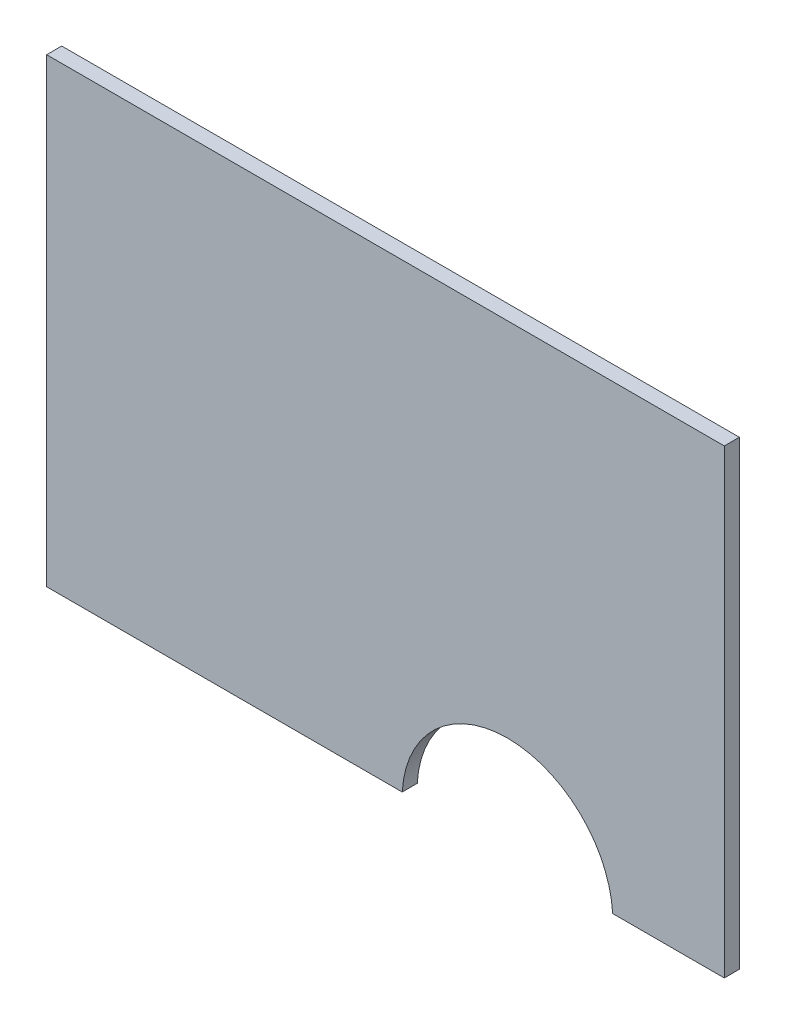
ISO-10303-21;
HEADER;
FILE_DESCRIPTION(('STEP AP214'),'2;1');
FILE_NAME('part.step','',(''),(''),'','','');
FILE_SCHEMA(('AUTOMOTIVE_DESIGN { 1 0 10303 214 1 1 1 1 }'));
ENDSEC;
DATA;
#1=APPLICATION_CONTEXT('core data for automotive mechanical design processes');
#2=APPLICATION_PROTOCOL_DEFINITION('international standard','automotive_design',2000,#1);
#3=PRODUCT_CONTEXT('',#1,'mechanical');
#4=PRODUCT('Part','Part','',(#3));
#5=PRODUCT_RELATED_PRODUCT_CATEGORY('part','',(#4));
#6=PRODUCT_DEFINITION_FORMATION('','',#4);
#7=PRODUCT_DEFINITION_CONTEXT('part definition',#1,'design');
#8=PRODUCT_DEFINITION('design','',#6,#7);
#9=PRODUCT_DEFINITION_SHAPE('','',#8);
#10=(LENGTH_UNIT() NAMED_UNIT(*) SI_UNIT(.MILLI.,.METRE.));
#11=(NAMED_UNIT(*) PLANE_ANGLE_UNIT() SI_UNIT($,.RADIAN.));
#12=(NAMED_UNIT(*) SI_UNIT($,.STERADIAN.) SOLID_ANGLE_UNIT());
#13=UNCERTAINTY_MEASURE_WITH_UNIT(LENGTH_MEASURE(1.E-05),#10,'distance_accuracy_value','');
#14=(GEOMETRIC_REPRESENTATION_CONTEXT(3) GLOBAL_UNCERTAINTY_ASSIGNED_CONTEXT((#13)) GLOBAL_UNIT_ASSIGNED_CONTEXT((#10,
#11,#12)) REPRESENTATION_CONTEXT('',''));
#15=CARTESIAN_POINT('',(0.,0.,0.));
#16=DIRECTION('',(0.,0.,1.));
#17=DIRECTION('',(1.,0.,0.));
#18=AXIS2_PLACEMENT_3D('',#15,#16,#17);
#19=CARTESIAN_POINT('',(-980.231317194732,0.,127.020467364411));
#20=DIRECTION('',(0.,1.,0.));
#21=DIRECTION('',(0.,0.,1.));
#22=AXIS2_PLACEMENT_3D('',#19,#20,#21);
#23=PLANE('',#22);
#24=DIRECTION('',(1.,0.,0.));
#25=VECTOR('',#24,1.);
#26=CARTESIAN_POINT('',(-980.231317194732,0.,122.020467364411));
#27=LINE('',#26,#25);
#28=CARTESIAN_POINT('',(-980.231317194732,0.,122.020467364411));
#29=VERTEX_POINT('',#28);
#30=CARTESIAN_POINT('',(-862.174127614044,0.,122.020467364411));
#31=VERTEX_POINT('',#30);
#32=EDGE_CURVE('E87',#29,#31,#27,.T.);
#33=ORIENTED_EDGE('',*,*,#32,.T.);
#34=DIRECTION('',(0.,0.,1.));
#35=VECTOR('',#34,1.);
#36=CARTESIAN_POINT('',(-862.174127614044,0.,122.020467364411));
#37=LINE('',#36,#35);
#38=CARTESIAN_POINT('',(-862.174127614044,0.,127.020467364411));
#39=VERTEX_POINT('',#38);
#40=EDGE_CURVE('E53',#31,#39,#37,.T.);
#41=ORIENTED_EDGE('',*,*,#40,.T.);
#42=DIRECTION('',(1.,0.,0.));
#43=VECTOR('',#42,1.);
#44=CARTESIAN_POINT('',(-980.231317194732,0.,127.020467364411));
#45=LINE('',#44,#43);
#46=CARTESIAN_POINT('',(-980.231317194732,0.,127.020467364411));
#47=VERTEX_POINT('',#46);
#48=EDGE_CURVE('E108',#47,#39,#45,.T.);
#49=ORIENTED_EDGE('',*,*,#48,.F.);
#50=DIRECTION('',(0.,0.,-1.));
#51=VECTOR('',#50,1.);
#52=CARTESIAN_POINT('',(-980.231317194732,0.,127.020467364411));
#53=LINE('',#52,#51);
#54=EDGE_CURVE('E11',#47,#29,#53,.T.);
#55=ORIENTED_EDGE('',*,*,#54,.T.);
#56=EDGE_LOOP('',(#33,#41,#49,#55));
#57=FACE_BOUND('',#56,.T.);
#58=ADVANCED_FACE('F38',(#57),#23,.F.);
#59=CARTESIAN_POINT('',(-980.231317194732,0.,127.020467364411));
#60=DIRECTION('',(1.,0.,0.));
#61=DIRECTION('',(0.,0.,-1.));
#62=AXIS2_PLACEMENT_3D('',#59,#60,#61);
#63=PLANE('',#62);
#64=DIRECTION('',(0.,-1.,0.));
#65=VECTOR('',#64,1.);
#66=CARTESIAN_POINT('',(-980.231317194732,0.,122.020467364411));
#67=LINE('',#66,#65);
#68=CARTESIAN_POINT('',(-980.231317194732,153.,122.020467364411));
#69=VERTEX_POINT('',#68);
#70=EDGE_CURVE('E92',#69,#29,#67,.T.);
#71=ORIENTED_EDGE('',*,*,#70,.T.);
#72=ORIENTED_EDGE('',*,*,#54,.F.);
#73=DIRECTION('',(0.,-1.,0.));
#74=VECTOR('',#73,1.);
#75=CARTESIAN_POINT('',(-980.231317194732,0.,127.020467364411));
#76=LINE('',#75,#74);
#77=CARTESIAN_POINT('',(-980.231317194732,153.,127.020467364411));
#78=VERTEX_POINT('',#77);
#79=EDGE_CURVE('E86',#78,#47,#76,.T.);
#80=ORIENTED_EDGE('',*,*,#79,.F.);
#81=DIRECTION('',(0.,0.,-1.));
#82=VECTOR('',#81,1.);
#83=CARTESIAN_POINT('',(-980.231317194732,153.,127.020467364411));
#84=LINE('',#83,#82);
#85=EDGE_CURVE('E46',#78,#69,#84,.T.);
#86=ORIENTED_EDGE('',*,*,#85,.T.);
#87=EDGE_LOOP('',(#71,#72,#80,#86));
#88=FACE_BOUND('',#87,.T.);
#89=ADVANCED_FACE('F40',(#88),#63,.F.);
#90=CARTESIAN_POINT('',(-792.288506775419,0.,127.020467364411));
#91=VERTEX_POINT('',#90);
#92=CARTESIAN_POINT('',(-755.231317194732,0.,127.020467364411));
#93=VERTEX_POINT('',#92);
#94=EDGE_CURVE('E110',#91,#93,#45,.T.);
#95=ORIENTED_EDGE('',*,*,#94,.F.);
#96=DIRECTION('',(0.,0.,1.));
#97=VECTOR('',#96,1.);
#98=CARTESIAN_POINT('',(-792.288506775419,0.,122.020467364411));
#99=LINE('',#98,#97);
#100=CARTESIAN_POINT('',(-792.288506775419,0.,122.020467364411));
#101=VERTEX_POINT('',#100);
#102=EDGE_CURVE('E116',#101,#91,#99,.T.);
#103=ORIENTED_EDGE('',*,*,#102,.F.);
#104=CARTESIAN_POINT('',(-755.231317194732,0.,122.020467364411));
#105=VERTEX_POINT('',#104);
#106=EDGE_CURVE('E95',#101,#105,#27,.T.);
#107=ORIENTED_EDGE('',*,*,#106,.T.);
#108=DIRECTION('',(0.,0.,1.));
#109=VECTOR('',#108,1.);
#110=CARTESIAN_POINT('',(-755.231317194732,0.,127.020467364411));
#111=LINE('',#110,#109);
#112=EDGE_CURVE('E96',#105,#93,#111,.T.);
#113=ORIENTED_EDGE('',*,*,#112,.T.);
#114=EDGE_LOOP('',(#95,#103,#107,#113));
#115=FACE_BOUND('',#114,.T.);
#116=ADVANCED_FACE('F135',(#115),#23,.F.);
#117=CARTESIAN_POINT('',(-980.231317194732,153.,127.020467364411));
#118=DIRECTION('',(0.,-1.,0.));
#119=DIRECTION('',(0.,0.,-1.));
#120=AXIS2_PLACEMENT_3D('',#117,#118,#119);
#121=PLANE('',#120);
#122=DIRECTION('',(-1.,0.,0.));
#123=VECTOR('',#122,1.);
#124=CARTESIAN_POINT('',(-980.231317194732,153.,122.020467364411));
#125=LINE('',#124,#123);
#126=CARTESIAN_POINT('',(-755.231317194732,153.,122.020467364411));
#127=VERTEX_POINT('',#126);
#128=EDGE_CURVE('E76',#127,#69,#125,.T.);
#129=ORIENTED_EDGE('',*,*,#128,.T.);
#130=ORIENTED_EDGE('',*,*,#85,.F.);
#131=DIRECTION('',(-1.,0.,0.));
#132=VECTOR('',#131,1.);
#133=CARTESIAN_POINT('',(-980.231317194732,153.,127.020467364411));
#134=LINE('',#133,#132);
#135=CARTESIAN_POINT('',(-755.231317194732,153.,127.020467364411));
#136=VERTEX_POINT('',#135);
#137=EDGE_CURVE('E62',#136,#78,#134,.T.);
#138=ORIENTED_EDGE('',*,*,#137,.F.);
#139=DIRECTION('',(0.,0.,-1.));
#140=VECTOR('',#139,1.);
#141=CARTESIAN_POINT('',(-755.231317194732,153.,122.020467364411));
#142=LINE('',#141,#140);
#143=EDGE_CURVE('E81',#136,#127,#142,.T.);
#144=ORIENTED_EDGE('',*,*,#143,.T.);
#145=EDGE_LOOP('',(#129,#130,#138,#144));
#146=FACE_BOUND('',#145,.T.);
#147=ADVANCED_FACE('F78',(#146),#121,.F.);
#148=CARTESIAN_POINT('',(0.,0.,127.020467364411));
#149=DIRECTION('',(0.,0.,-1.));
#150=DIRECTION('',(-1.,0.,0.));
#151=AXIS2_PLACEMENT_3D('',#148,#149,#150);
#152=PLANE('',#151);
#153=ORIENTED_EDGE('',*,*,#48,.T.);
#154=CARTESIAN_POINT('',(-827.231317194732,-2.00000000000015,127.020467364411));
#155=DIRECTION('',(0.,0.,1.));
#156=DIRECTION('',(1.,0.,0.));
#157=AXIS2_PLACEMENT_3D('',#154,#155,#156);
#158=CIRCLE('',#157,35.);
#159=EDGE_CURVE('E124',#91,#39,#158,.T.);
#160=ORIENTED_EDGE('',*,*,#159,.F.);
#161=ORIENTED_EDGE('',*,*,#94,.T.);
#162=DIRECTION('',(0.,1.,0.));
#163=VECTOR('',#162,1.);
#164=CARTESIAN_POINT('',(-755.231317194732,153.,127.020467364411));
#165=LINE('',#164,#163);
#166=EDGE_CURVE('E115',#93,#136,#165,.T.);
#167=ORIENTED_EDGE('',*,*,#166,.T.);
#168=ORIENTED_EDGE('',*,*,#137,.T.);
#169=ORIENTED_EDGE('',*,*,#79,.T.);
#170=EDGE_LOOP('',(#153,#160,#161,#167,#168,#169));
#171=FACE_BOUND('',#170,.T.);
#172=ADVANCED_FACE('F111',(#171),#152,.F.);
#173=CARTESIAN_POINT('',(0.,0.,122.020467364411));
#174=DIRECTION('',(0.,0.,-1.));
#175=DIRECTION('',(-1.,0.,0.));
#176=AXIS2_PLACEMENT_3D('',#173,#174,#175);
#177=PLANE('',#176);
#178=CARTESIAN_POINT('',(-827.231317194732,-2.00000000000015,122.020467364411));
#179=DIRECTION('',(0.,0.,1.));
#180=DIRECTION('',(1.,0.,0.));
#181=AXIS2_PLACEMENT_3D('',#178,#179,#180);
#182=CIRCLE('',#181,35.);
#183=EDGE_CURVE('E121',#101,#31,#182,.T.);
#184=ORIENTED_EDGE('',*,*,#183,.T.);
#185=ORIENTED_EDGE('',*,*,#32,.F.);
#186=ORIENTED_EDGE('',*,*,#70,.F.);
#187=ORIENTED_EDGE('',*,*,#128,.F.);
#188=DIRECTION('',(0.,-1.,0.));
#189=VECTOR('',#188,1.);
#190=CARTESIAN_POINT('',(-755.231317194732,0.,122.020467364411));
#191=LINE('',#190,#189);
#192=EDGE_CURVE('E101',#127,#105,#191,.T.);
#193=ORIENTED_EDGE('',*,*,#192,.T.);
#194=ORIENTED_EDGE('',*,*,#106,.F.);
#195=EDGE_LOOP('',(#184,#185,#186,#187,#193,#194));
#196=FACE_BOUND('',#195,.T.);
#197=ADVANCED_FACE('F93',(#196),#177,.T.);
#198=CARTESIAN_POINT('',(-755.231317194732,0.,0.));
#199=DIRECTION('',(-1.,0.,0.));
#200=DIRECTION('',(0.,0.,1.));
#201=AXIS2_PLACEMENT_3D('',#198,#199,#200);
#202=PLANE('',#201);
#203=ORIENTED_EDGE('',*,*,#192,.F.);
#204=ORIENTED_EDGE('',*,*,#143,.F.);
#205=ORIENTED_EDGE('',*,*,#166,.F.);
#206=ORIENTED_EDGE('',*,*,#112,.F.);
#207=EDGE_LOOP('',(#203,#204,#205,#206));
#208=FACE_BOUND('',#207,.T.);
#209=ADVANCED_FACE('F143',(#208),#202,.F.);
#210=CARTESIAN_POINT('',(-827.231317194732,-2.00000000000015,122.020467364411));
#211=DIRECTION('',(0.,0.,1.));
#212=DIRECTION('',(1.,0.,0.));
#213=AXIS2_PLACEMENT_3D('',#210,#211,#212);
#214=CYLINDRICAL_SURFACE('',#213,35.);
#215=ORIENTED_EDGE('',*,*,#159,.T.);
#216=ORIENTED_EDGE('',*,*,#40,.F.);
#217=ORIENTED_EDGE('',*,*,#183,.F.);
#218=ORIENTED_EDGE('',*,*,#102,.T.);
#219=EDGE_LOOP('',(#215,#216,#217,#218));
#220=FACE_BOUND('',#219,.T.);
#221=ADVANCED_FACE('F129',(#220),#214,.F.);
#222=CLOSED_SHELL('',(#58,#89,#116,#147,#172,#197,#209,#221));
#223=MANIFOLD_SOLID_BREP('B2',#222);
#224=ADVANCED_BREP_SHAPE_REPRESENTATION('',(#18,#223),#14);
#225=SHAPE_DEFINITION_REPRESENTATION(#9,#224);
ENDSEC;
END-ISO-10303-21;
